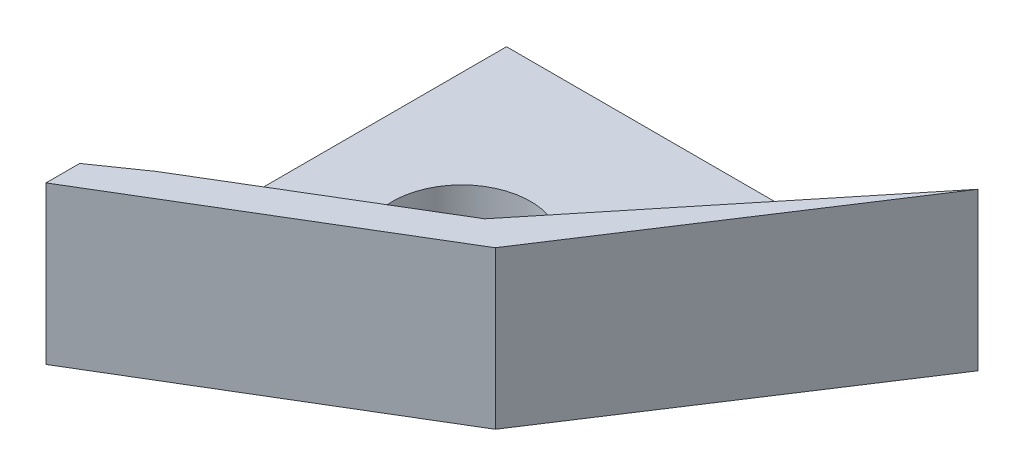
ISO-10303-21;
HEADER;
FILE_DESCRIPTION(('STEP AP214'),'2;1');
FILE_NAME('part.step','',(''),(''),'','','');
FILE_SCHEMA(('AUTOMOTIVE_DESIGN { 1 0 10303 214 1 1 1 1 }'));
ENDSEC;
DATA;
#1=APPLICATION_CONTEXT('core data for automotive mechanical design processes');
#2=APPLICATION_PROTOCOL_DEFINITION('international standard','automotive_design',2000,#1);
#3=PRODUCT_CONTEXT('',#1,'mechanical');
#4=PRODUCT('Part','Part','',(#3));
#5=PRODUCT_RELATED_PRODUCT_CATEGORY('part','',(#4));
#6=PRODUCT_DEFINITION_FORMATION('','',#4);
#7=PRODUCT_DEFINITION_CONTEXT('part definition',#1,'design');
#8=PRODUCT_DEFINITION('design','',#6,#7);
#9=PRODUCT_DEFINITION_SHAPE('','',#8);
#10=(LENGTH_UNIT() NAMED_UNIT(*) SI_UNIT(.MILLI.,.METRE.));
#11=(NAMED_UNIT(*) PLANE_ANGLE_UNIT() SI_UNIT($,.RADIAN.));
#12=(NAMED_UNIT(*) SI_UNIT($,.STERADIAN.) SOLID_ANGLE_UNIT());
#13=UNCERTAINTY_MEASURE_WITH_UNIT(LENGTH_MEASURE(1.E-05),#10,'distance_accuracy_value','');
#14=(GEOMETRIC_REPRESENTATION_CONTEXT(3) GLOBAL_UNCERTAINTY_ASSIGNED_CONTEXT((#13)) GLOBAL_UNIT_ASSIGNED_CONTEXT((#10,
#11,#12)) REPRESENTATION_CONTEXT('',''));
#15=CARTESIAN_POINT('',(0.,0.,0.));
#16=DIRECTION('',(0.,0.,1.));
#17=DIRECTION('',(1.,0.,0.));
#18=AXIS2_PLACEMENT_3D('',#15,#16,#17);
#19=CARTESIAN_POINT('',(0.,2.,0.));
#20=DIRECTION('',(0.,1.,0.));
#21=DIRECTION('',(0.,0.,1.));
#22=AXIS2_PLACEMENT_3D('',#19,#20,#21);
#23=PLANE('',#22);
#24=DIRECTION('',(-0.630193659855362,0.,0.776437989203326));
#25=VECTOR('',#24,1.);
#26=CARTESIAN_POINT('',(113.820583027473,2.,92.3821487129353));
#27=LINE('',#26,#25);
#28=CARTESIAN_POINT('',(90.8714601720809,2.,120.65690287011));
#29=VERTEX_POINT('',#28);
#30=CARTESIAN_POINT('',(81.0344350396024,2.,132.776732852781));
#31=VERTEX_POINT('',#30);
#32=EDGE_CURVE('E129',#29,#31,#27,.T.);
#33=ORIENTED_EDGE('',*,*,#32,.F.);
#34=DIRECTION('',(-1.,0.,0.));
#35=VECTOR('',#34,1.);
#36=CARTESIAN_POINT('',(69.8822956151013,2.,120.65690287011));
#37=LINE('',#36,#35);
#38=CARTESIAN_POINT('',(69.8822956151013,2.,120.65690287011));
#39=VERTEX_POINT('',#38);
#40=EDGE_CURVE('E144',#29,#39,#37,.T.);
#41=ORIENTED_EDGE('',*,*,#40,.T.);
#42=DIRECTION('',(0.,0.,1.));
#43=VECTOR('',#42,1.);
#44=CARTESIAN_POINT('',(69.8822956151013,2.,141.15690287011));
#45=LINE('',#44,#43);
#46=CARTESIAN_POINT('',(69.8822956151013,2.,139.65690287011));
#47=VERTEX_POINT('',#46);
#48=EDGE_CURVE('E147',#39,#47,#45,.T.);
#49=ORIENTED_EDGE('',*,*,#48,.T.);
#50=DIRECTION('',(-0.821370451746982,0.,0.5703951095486));
#51=VECTOR('',#50,1.);
#52=CARTESIAN_POINT('',(88.166298955197,2.,126.959701423456));
#53=LINE('',#52,#51);
#54=CARTESIAN_POINT('',(71.8822956151013,2.,138.268016507482));
#55=VERTEX_POINT('',#54);
#56=EDGE_CURVE('E53',#55,#47,#53,.T.);
#57=ORIENTED_EDGE('',*,*,#56,.F.);
#58=DIRECTION('',(-0.857492925712546,0.,0.514495755427524));
#59=VECTOR('',#58,1.);
#60=CARTESIAN_POINT('',(80.0282620043566,2.,133.380436673929));
#61=LINE('',#60,#59);
#62=EDGE_CURVE('E48',#31,#55,#61,.T.);
#63=ORIENTED_EDGE('',*,*,#62,.F.);
#64=EDGE_LOOP('',(#33,#41,#49,#57,#63));
#65=FACE_BOUND('',#64,.T.);
#66=CARTESIAN_POINT('',(76.3822956151013,2.,129.15690287011));
#67=DIRECTION('',(0.,1.,0.));
#68=DIRECTION('',(0.,0.,1.));
#69=AXIS2_PLACEMENT_3D('',#66,#67,#68);
#70=CIRCLE('',#69,3.07499999999999);
#71=CARTESIAN_POINT('',(76.3822956151013,2.,132.23190287011));
#72=VERTEX_POINT('',#71);
#73=EDGE_CURVE('E138',#72,#72,#70,.T.);
#74=ORIENTED_EDGE('',*,*,#73,.F.);
#75=EDGE_LOOP('',(#74));
#76=FACE_BOUND('',#75,.T.);
#77=ADVANCED_FACE('F33',(#65,#76),#23,.T.);
#78=CARTESIAN_POINT('',(0.,0.,0.));
#79=DIRECTION('',(0.,1.,0.));
#80=DIRECTION('',(0.,0.,1.));
#81=AXIS2_PLACEMENT_3D('',#78,#79,#80);
#82=PLANE('',#81);
#83=DIRECTION('',(-1.,0.,0.));
#84=VECTOR('',#83,1.);
#85=CARTESIAN_POINT('',(69.8822956151013,0.,120.65690287011));
#86=LINE('',#85,#84);
#87=CARTESIAN_POINT('',(90.8714601720809,0.,120.65690287011));
#88=VERTEX_POINT('',#87);
#89=CARTESIAN_POINT('',(69.8822956151013,0.,120.65690287011));
#90=VERTEX_POINT('',#89);
#91=EDGE_CURVE('E141',#88,#90,#86,.T.);
#92=ORIENTED_EDGE('',*,*,#91,.F.);
#93=DIRECTION('',(0.546760394266227,0.,-0.837289120472636));
#94=VECTOR('',#93,1.);
#95=CARTESIAN_POINT('',(90.8714601720809,0.,120.65690287011));
#96=LINE('',#95,#94);
#97=CARTESIAN_POINT('',(82.3822956151013,0.,133.65690287011));
#98=VERTEX_POINT('',#97);
#99=EDGE_CURVE('E148',#98,#88,#96,.T.);
#100=ORIENTED_EDGE('',*,*,#99,.F.);
#101=DIRECTION('',(0.857492925712545,0.,-0.514495755427525));
#102=VECTOR('',#101,1.);
#103=CARTESIAN_POINT('',(69.8822956151013,0.,141.15690287011));
#104=LINE('',#103,#102);
#105=CARTESIAN_POINT('',(69.8822956151013,0.,141.15690287011));
#106=VERTEX_POINT('',#105);
#107=EDGE_CURVE('E155',#106,#98,#104,.T.);
#108=ORIENTED_EDGE('',*,*,#107,.F.);
#109=DIRECTION('',(0.,0.,1.));
#110=VECTOR('',#109,1.);
#111=CARTESIAN_POINT('',(69.8822956151013,0.,141.15690287011));
#112=LINE('',#111,#110);
#113=EDGE_CURVE('E153',#90,#106,#112,.T.);
#114=ORIENTED_EDGE('',*,*,#113,.F.);
#115=EDGE_LOOP('',(#92,#100,#108,#114));
#116=FACE_BOUND('',#115,.T.);
#117=CARTESIAN_POINT('',(76.3822956151013,0.,129.15690287011));
#118=DIRECTION('',(0.,1.,0.));
#119=DIRECTION('',(0.,0.,1.));
#120=AXIS2_PLACEMENT_3D('',#117,#118,#119);
#121=CIRCLE('',#120,3.07499999999999);
#122=CARTESIAN_POINT('',(76.3822956151013,0.,132.23190287011));
#123=VERTEX_POINT('',#122);
#124=EDGE_CURVE('E137',#123,#123,#121,.T.);
#125=ORIENTED_EDGE('',*,*,#124,.T.);
#126=EDGE_LOOP('',(#125));
#127=FACE_BOUND('',#126,.T.);
#128=ADVANCED_FACE('F168',(#116,#127),#82,.F.);
#129=CARTESIAN_POINT('',(69.8822956151013,2.,120.65690287011));
#130=DIRECTION('',(0.,0.,1.));
#131=DIRECTION('',(1.,0.,0.));
#132=AXIS2_PLACEMENT_3D('',#129,#130,#131);
#133=PLANE('',#132);
#134=ORIENTED_EDGE('',*,*,#91,.T.);
#135=DIRECTION('',(0.,-1.,0.));
#136=VECTOR('',#135,1.);
#137=CARTESIAN_POINT('',(69.8822956151013,2.,120.65690287011));
#138=LINE('',#137,#136);
#139=EDGE_CURVE('E11',#39,#90,#138,.T.);
#140=ORIENTED_EDGE('',*,*,#139,.F.);
#141=ORIENTED_EDGE('',*,*,#40,.F.);
#142=DIRECTION('',(0.,-1.,0.));
#143=VECTOR('',#142,1.);
#144=CARTESIAN_POINT('',(90.8714601720809,2.,120.65690287011));
#145=LINE('',#144,#143);
#146=EDGE_CURVE('E150',#29,#88,#145,.T.);
#147=ORIENTED_EDGE('',*,*,#146,.T.);
#148=EDGE_LOOP('',(#134,#140,#141,#147));
#149=FACE_BOUND('',#148,.T.);
#150=ADVANCED_FACE('F35',(#149),#133,.F.);
#151=CARTESIAN_POINT('',(69.8822956151013,2.,141.15690287011));
#152=DIRECTION('',(1.,0.,0.));
#153=DIRECTION('',(0.,0.,-1.));
#154=AXIS2_PLACEMENT_3D('',#151,#152,#153);
#155=PLANE('',#154);
#156=ORIENTED_EDGE('',*,*,#113,.T.);
#157=DIRECTION('',(0.,-1.,0.));
#158=VECTOR('',#157,1.);
#159=CARTESIAN_POINT('',(69.8822956151013,2.,141.15690287011));
#160=LINE('',#159,#158);
#161=CARTESIAN_POINT('',(69.8822956151013,7.,141.15690287011));
#162=VERTEX_POINT('',#161);
#163=EDGE_CURVE('E41',#162,#106,#160,.T.);
#164=ORIENTED_EDGE('',*,*,#163,.F.);
#165=DIRECTION('',(0.,0.,-1.));
#166=VECTOR('',#165,1.);
#167=CARTESIAN_POINT('',(69.8822956151013,7.,139.65690287011));
#168=LINE('',#167,#166);
#169=CARTESIAN_POINT('',(69.8822956151013,7.,139.65690287011));
#170=VERTEX_POINT('',#169);
#171=EDGE_CURVE('E108',#162,#170,#168,.T.);
#172=ORIENTED_EDGE('',*,*,#171,.T.);
#173=DIRECTION('',(0.,-1.,0.));
#174=VECTOR('',#173,1.);
#175=CARTESIAN_POINT('',(69.8822956151013,7.,139.65690287011));
#176=LINE('',#175,#174);
#177=EDGE_CURVE('E93',#170,#47,#176,.T.);
#178=ORIENTED_EDGE('',*,*,#177,.T.);
#179=ORIENTED_EDGE('',*,*,#48,.F.);
#180=ORIENTED_EDGE('',*,*,#139,.T.);
#181=EDGE_LOOP('',(#156,#164,#172,#178,#179,#180));
#182=FACE_BOUND('',#181,.T.);
#183=ADVANCED_FACE('F114',(#182),#155,.F.);
#184=CARTESIAN_POINT('',(69.8822956151013,2.,141.15690287011));
#185=DIRECTION('',(-0.514495755427525,0.,-0.857492925712545));
#186=DIRECTION('',(-0.857492925712545,0.,0.514495755427525));
#187=AXIS2_PLACEMENT_3D('',#184,#185,#186);
#188=PLANE('',#187);
#189=ORIENTED_EDGE('',*,*,#107,.T.);
#190=DIRECTION('',(0.,-1.,0.));
#191=VECTOR('',#190,1.);
#192=CARTESIAN_POINT('',(82.3822956151013,2.,133.65690287011));
#193=LINE('',#192,#191);
#194=CARTESIAN_POINT('',(82.3822956151013,7.,133.65690287011));
#195=VERTEX_POINT('',#194);
#196=EDGE_CURVE('E160',#195,#98,#193,.T.);
#197=ORIENTED_EDGE('',*,*,#196,.F.);
#198=DIRECTION('',(-0.857492925712545,0.,0.514495755427525));
#199=VECTOR('',#198,1.);
#200=CARTESIAN_POINT('',(69.8822956151013,7.,141.15690287011));
#201=LINE('',#200,#199);
#202=EDGE_CURVE('E101',#195,#162,#201,.T.);
#203=ORIENTED_EDGE('',*,*,#202,.T.);
#204=ORIENTED_EDGE('',*,*,#163,.T.);
#205=EDGE_LOOP('',(#189,#197,#203,#204));
#206=FACE_BOUND('',#205,.T.);
#207=ADVANCED_FACE('F164',(#206),#188,.F.);
#208=CARTESIAN_POINT('',(90.8714601720809,2.,120.65690287011));
#209=DIRECTION('',(-0.837289120472636,0.,-0.546760394266227));
#210=DIRECTION('',(-0.546760394266227,0.,0.837289120472636));
#211=AXIS2_PLACEMENT_3D('',#208,#209,#210);
#212=PLANE('',#211);
#213=ORIENTED_EDGE('',*,*,#99,.T.);
#214=ORIENTED_EDGE('',*,*,#146,.F.);
#215=DIRECTION('',(0.,-1.,0.));
#216=VECTOR('',#215,1.);
#217=CARTESIAN_POINT('',(90.8714601720809,7.,120.65690287011));
#218=LINE('',#217,#216);
#219=CARTESIAN_POINT('',(90.8714601720809,7.,120.65690287011));
#220=VERTEX_POINT('',#219);
#221=EDGE_CURVE('E126',#220,#29,#218,.T.);
#222=ORIENTED_EDGE('',*,*,#221,.F.);
#223=DIRECTION('',(-0.546760394266227,0.,0.837289120472636));
#224=VECTOR('',#223,1.);
#225=CARTESIAN_POINT('',(82.3822956151013,7.,133.65690287011));
#226=LINE('',#225,#224);
#227=EDGE_CURVE('E122',#220,#195,#226,.T.);
#228=ORIENTED_EDGE('',*,*,#227,.T.);
#229=ORIENTED_EDGE('',*,*,#196,.T.);
#230=EDGE_LOOP('',(#213,#214,#222,#228,#229));
#231=FACE_BOUND('',#230,.T.);
#232=ADVANCED_FACE('F172',(#231),#212,.F.);
#233=CARTESIAN_POINT('',(76.3822956151013,2.,129.15690287011));
#234=DIRECTION('',(0.,-1.,0.));
#235=DIRECTION('',(0.,0.,-1.));
#236=AXIS2_PLACEMENT_3D('',#233,#234,#235);
#237=CYLINDRICAL_SURFACE('',#236,3.07499999999999);
#238=ORIENTED_EDGE('',*,*,#73,.T.);
#239=EDGE_LOOP('',(#238));
#240=FACE_BOUND('',#239,.T.);
#241=ORIENTED_EDGE('',*,*,#124,.F.);
#242=EDGE_LOOP('',(#241));
#243=FACE_BOUND('',#242,.T.);
#244=ADVANCED_FACE('F188',(#240,#243),#237,.F.);
#245=CARTESIAN_POINT('',(81.0344350396024,7.,132.776732852781));
#246=DIRECTION('',(-0.776437989203326,0.,-0.630193659855362));
#247=DIRECTION('',(-0.630193659855362,0.,0.776437989203326));
#248=AXIS2_PLACEMENT_3D('',#245,#246,#247);
#249=PLANE('',#248);
#250=ORIENTED_EDGE('',*,*,#221,.T.);
#251=ORIENTED_EDGE('',*,*,#32,.T.);
#252=DIRECTION('',(0.,-1.,0.));
#253=VECTOR('',#252,1.);
#254=CARTESIAN_POINT('',(81.0344350396024,7.,132.776732852781));
#255=LINE('',#254,#253);
#256=CARTESIAN_POINT('',(81.0344350396024,7.,132.776732852781));
#257=VERTEX_POINT('',#256);
#258=EDGE_CURVE('E130',#257,#31,#255,.T.);
#259=ORIENTED_EDGE('',*,*,#258,.F.);
#260=DIRECTION('',(0.630193659855362,0.,-0.776437989203326));
#261=VECTOR('',#260,1.);
#262=CARTESIAN_POINT('',(81.0344350396024,7.,132.776732852781));
#263=LINE('',#262,#261);
#264=EDGE_CURVE('E119',#257,#220,#263,.T.);
#265=ORIENTED_EDGE('',*,*,#264,.T.);
#266=EDGE_LOOP('',(#250,#251,#259,#265));
#267=FACE_BOUND('',#266,.T.);
#268=ADVANCED_FACE('F177',(#267),#249,.T.);
#269=CARTESIAN_POINT('',(71.8822956151013,7.,138.268016507482));
#270=DIRECTION('',(-0.514495755427524,0.,-0.857492925712546));
#271=DIRECTION('',(-0.857492925712546,0.,0.514495755427524));
#272=AXIS2_PLACEMENT_3D('',#269,#270,#271);
#273=PLANE('',#272);
#274=ORIENTED_EDGE('',*,*,#258,.T.);
#275=ORIENTED_EDGE('',*,*,#62,.T.);
#276=DIRECTION('',(0.,-1.,0.));
#277=VECTOR('',#276,1.);
#278=CARTESIAN_POINT('',(71.8822956151013,7.,138.268016507482));
#279=LINE('',#278,#277);
#280=CARTESIAN_POINT('',(71.8822956151013,7.,138.268016507482));
#281=VERTEX_POINT('',#280);
#282=EDGE_CURVE('E100',#281,#55,#279,.T.);
#283=ORIENTED_EDGE('',*,*,#282,.F.);
#284=DIRECTION('',(0.857492925712546,0.,-0.514495755427524));
#285=VECTOR('',#284,1.);
#286=CARTESIAN_POINT('',(71.8822956151013,7.,138.268016507482));
#287=LINE('',#286,#285);
#288=EDGE_CURVE('E112',#281,#257,#287,.T.);
#289=ORIENTED_EDGE('',*,*,#288,.T.);
#290=EDGE_LOOP('',(#274,#275,#283,#289));
#291=FACE_BOUND('',#290,.T.);
#292=ADVANCED_FACE('F180',(#291),#273,.T.);
#293=CARTESIAN_POINT('',(71.8822956151013,7.,138.268016507482));
#294=DIRECTION('',(-0.5703951095486,0.,-0.821370451746981));
#295=DIRECTION('',(-0.821370451746982,0.,0.5703951095486));
#296=AXIS2_PLACEMENT_3D('',#293,#294,#295);
#297=PLANE('',#296);
#298=ORIENTED_EDGE('',*,*,#282,.T.);
#299=ORIENTED_EDGE('',*,*,#56,.T.);
#300=ORIENTED_EDGE('',*,*,#177,.F.);
#301=DIRECTION('',(0.821370451746981,0.,-0.5703951095486));
#302=VECTOR('',#301,1.);
#303=CARTESIAN_POINT('',(71.8822956151013,7.,138.268016507482));
#304=LINE('',#303,#302);
#305=EDGE_CURVE('E97',#170,#281,#304,.T.);
#306=ORIENTED_EDGE('',*,*,#305,.T.);
#307=EDGE_LOOP('',(#298,#299,#300,#306));
#308=FACE_BOUND('',#307,.T.);
#309=ADVANCED_FACE('F96',(#308),#297,.T.);
#310=CARTESIAN_POINT('',(0.,7.,0.));
#311=DIRECTION('',(0.,1.,0.));
#312=DIRECTION('',(0.,0.,1.));
#313=AXIS2_PLACEMENT_3D('',#310,#311,#312);
#314=PLANE('',#313);
#315=ORIENTED_EDGE('',*,*,#171,.F.);
#316=ORIENTED_EDGE('',*,*,#202,.F.);
#317=ORIENTED_EDGE('',*,*,#227,.F.);
#318=ORIENTED_EDGE('',*,*,#264,.F.);
#319=ORIENTED_EDGE('',*,*,#288,.F.);
#320=ORIENTED_EDGE('',*,*,#305,.F.);
#321=EDGE_LOOP('',(#315,#316,#317,#318,#319,#320));
#322=FACE_BOUND('',#321,.T.);
#323=ADVANCED_FACE('F106',(#322),#314,.T.);
#324=CLOSED_SHELL('',(#77,#128,#150,#183,#207,#232,#244,#268,#292,#309,#323));
#325=MANIFOLD_SOLID_BREP('B2',#324);
#326=ADVANCED_BREP_SHAPE_REPRESENTATION('',(#18,#325),#14);
#327=SHAPE_DEFINITION_REPRESENTATION(#9,#326);
ENDSEC;
END-ISO-10303-21;
